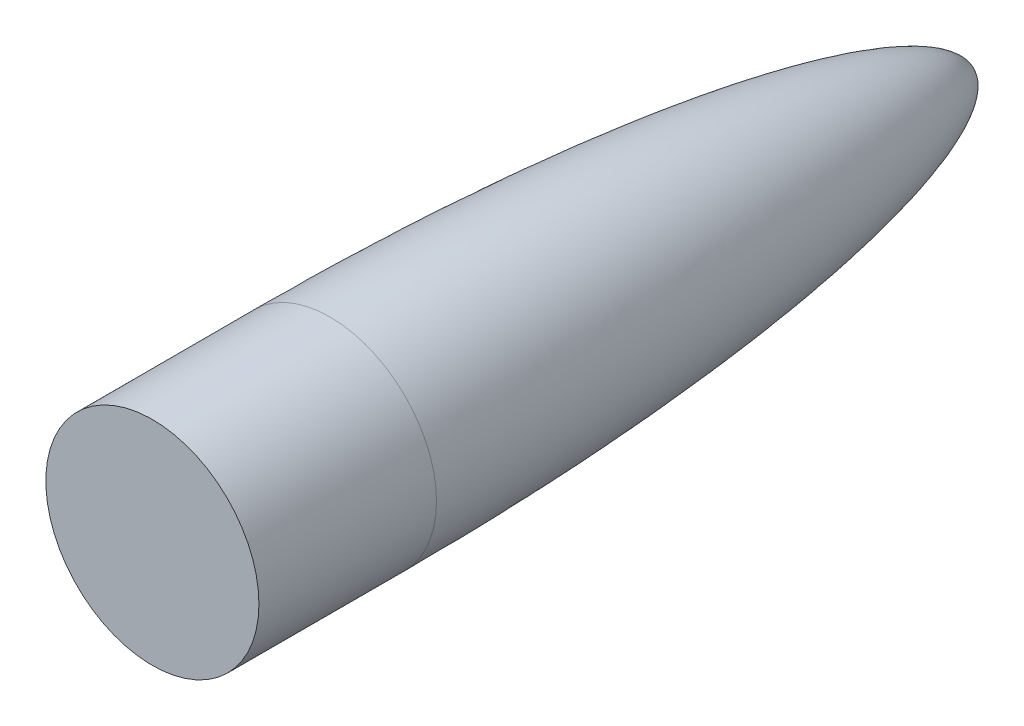
ISO-10303-21;
HEADER;
FILE_DESCRIPTION(('STEP AP214'),'2;1');
FILE_NAME('part.step','',(''),(''),'','','');
FILE_SCHEMA(('AUTOMOTIVE_DESIGN { 1 0 10303 214 1 1 1 1 }'));
ENDSEC;
DATA;
#1=APPLICATION_CONTEXT('core data for automotive mechanical design processes');
#2=APPLICATION_PROTOCOL_DEFINITION('international standard','automotive_design',2000,#1);
#3=PRODUCT_CONTEXT('',#1,'mechanical');
#4=PRODUCT('Part','Part','',(#3));
#5=PRODUCT_RELATED_PRODUCT_CATEGORY('part','',(#4));
#6=PRODUCT_DEFINITION_FORMATION('','',#4);
#7=PRODUCT_DEFINITION_CONTEXT('part definition',#1,'design');
#8=PRODUCT_DEFINITION('design','',#6,#7);
#9=PRODUCT_DEFINITION_SHAPE('','',#8);
#10=(LENGTH_UNIT() NAMED_UNIT(*) SI_UNIT(.MILLI.,.METRE.));
#11=(NAMED_UNIT(*) PLANE_ANGLE_UNIT() SI_UNIT($,.RADIAN.));
#12=(NAMED_UNIT(*) SI_UNIT($,.STERADIAN.) SOLID_ANGLE_UNIT());
#13=UNCERTAINTY_MEASURE_WITH_UNIT(LENGTH_MEASURE(1.E-05),#10,'distance_accuracy_value','');
#14=(GEOMETRIC_REPRESENTATION_CONTEXT(3) GLOBAL_UNCERTAINTY_ASSIGNED_CONTEXT((#13)) GLOBAL_UNIT_ASSIGNED_CONTEXT((#10,
#11,#12)) REPRESENTATION_CONTEXT('',''));
#15=CARTESIAN_POINT('',(0.,0.,0.));
#16=DIRECTION('',(0.,0.,1.));
#17=DIRECTION('',(1.,0.,0.));
#18=AXIS2_PLACEMENT_3D('',#15,#16,#17);
#19=CARTESIAN_POINT('',(0.,0.,127.));
#20=DIRECTION('',(0.,0.,-1.));
#21=DIRECTION('',(-1.,0.,0.));
#22=AXIS2_PLACEMENT_3D('',#19,#20,#21);
#23=CYLINDRICAL_SURFACE('',#22,76.2);
#24=CARTESIAN_POINT('',(0.,0.,127.));
#25=DIRECTION('',(0.,0.,1.));
#26=DIRECTION('',(1.,0.,0.));
#27=AXIS2_PLACEMENT_3D('',#24,#25,#26);
#28=CIRCLE('',#27,76.2);
#29=CARTESIAN_POINT('',(76.2,0.,127.));
#30=VERTEX_POINT('',#29);
#31=EDGE_CURVE('E11',#30,#30,#28,.T.);
#32=ORIENTED_EDGE('',*,*,#31,.F.);
#33=EDGE_LOOP('',(#32));
#34=FACE_BOUND('',#33,.T.);
#35=CARTESIAN_POINT('',(0.,0.,0.));
#36=DIRECTION('',(0.,0.,1.));
#37=DIRECTION('',(1.,0.,0.));
#38=AXIS2_PLACEMENT_3D('',#35,#36,#37);
#39=CIRCLE('',#38,76.2);
#40=CARTESIAN_POINT('',(76.2,0.,0.));
#41=VERTEX_POINT('',#40);
#42=EDGE_CURVE('E50',#41,#41,#39,.T.);
#43=ORIENTED_EDGE('',*,*,#42,.T.);
#44=EDGE_LOOP('',(#43));
#45=FACE_BOUND('',#44,.T.);
#46=ADVANCED_FACE('F39',(#34,#45),#23,.T.);
#47=CARTESIAN_POINT('',(0.,0.,127.));
#48=DIRECTION('',(0.,0.,1.));
#49=DIRECTION('',(1.,0.,0.));
#50=AXIS2_PLACEMENT_3D('',#47,#48,#49);
#51=PLANE('',#50);
#52=ORIENTED_EDGE('',*,*,#31,.T.);
#53=EDGE_LOOP('',(#52));
#54=FACE_BOUND('',#53,.T.);
#55=ADVANCED_FACE('F55',(#54),#51,.T.);
#56=CARTESIAN_POINT('',(0.,0.,-457.20000000036));
#57=CARTESIAN_POINT('',(0.,0.534505425826204,-457.199999783027));
#58=CARTESIAN_POINT('',(0.,1.42373238134091,-457.150080641547));
#59=CARTESIAN_POINT('',(0.,2.71521923637677,-456.955614881372));
#60=CARTESIAN_POINT('',(0.,4.4129638087914,-456.47260424758));
#61=CARTESIAN_POINT('',(0.,6.06046271653739,-455.800493322826));
#62=CARTESIAN_POINT('',(0.,7.9044388777587,-454.795004943715));
#63=CARTESIAN_POINT('',(0.,9.93908196723226,-453.370933283402));
#64=CARTESIAN_POINT('',(0.,12.2396075194511,-451.362493850984));
#65=CARTESIAN_POINT('',(0.,14.9275067360262,-448.481131890771));
#66=CARTESIAN_POINT('',(0.,18.1347136218381,-444.276883573398));
#67=CARTESIAN_POINT('',(0.,22.0574497401589,-437.961024740608));
#68=CARTESIAN_POINT('',(0.,26.8878539745448,-428.331965642796));
#69=CARTESIAN_POINT('',(0.,32.9593931991319,-413.166178505043));
#70=CARTESIAN_POINT('',(0.,39.8262165836885,-391.16484797936));
#71=CARTESIAN_POINT('',(0.,46.6366242791751,-363.148103265867));
#72=CARTESIAN_POINT('',(0.,52.08429790659,-334.84196883935));
#73=CARTESIAN_POINT('',(0.,56.2601064366329,-308.986583678613));
#74=CARTESIAN_POINT('',(0.,59.3136054356389,-287.376938666396));
#75=CARTESIAN_POINT('',(0.,61.529567186895,-270.058940881115));
#76=CARTESIAN_POINT('',(0.,63.5406140090686,-252.715935845925));
#77=CARTESIAN_POINT('',(0.,65.3647843318999,-235.352399190773));
#78=CARTESIAN_POINT('',(0.,67.0163771063259,-217.971608603075));
#79=CARTESIAN_POINT('',(0.,68.5073135504202,-200.576347756858));
#80=CARTESIAN_POINT('',(0.,69.8473256228097,-183.168839163237));
#81=CARTESIAN_POINT('',(0.,71.0445829697644,-165.750929012654));
#82=CARTESIAN_POINT('',(0.,71.9731931533787,-150.502604003337));
#83=CARTESIAN_POINT('',(0.,72.6877041595647,-137.42788786144));
#84=CARTESIAN_POINT('',(0.,73.2303042555184,-126.529690709381));
#85=CARTESIAN_POINT('',(0.,73.6332307411631,-117.809424576478));
#86=CARTESIAN_POINT('',(0.,74.0985534776012,-106.907850963105));
#87=CARTESIAN_POINT('',(0.,74.5964925216243,-93.8226418273542));
#88=CARTESIAN_POINT('',(0.,75.0910094922741,-78.5549922327913));
#89=CARTESIAN_POINT('',(0.,75.4840660879397,-63.2820804128631));
#90=CARTESIAN_POINT('',(0.,75.7497354297913,-50.1926820544756));
#91=CARTESIAN_POINT('',(0.,75.9066526777867,-40.3701170237372));
#92=CARTESIAN_POINT('',(0.,75.9937181520794,-33.8295867266813));
#93=CARTESIAN_POINT('',(0.,76.0546124076784,-28.36285029086));
#94=CARTESIAN_POINT('',(0.,76.096344577244,-24.0209759017673));
#95=CARTESIAN_POINT('',(0.,76.1311045577172,-19.6130894990075));
#96=CARTESIAN_POINT('',(0.,76.1589015464869,-15.3250603335263));
#97=CARTESIAN_POINT('',(0.,76.1797428784855,-10.8242807370204));
#98=CARTESIAN_POINT('',(0.,76.1936340507851,-6.72201940317497));
#99=CARTESIAN_POINT('',(0.,76.1988425547278,-3.01641859044547));
#100=CARTESIAN_POINT('',(0.,76.2000000000003,-0.995244189261283));
#101=CARTESIAN_POINT('',(0.,76.1999999999999,3.60062129747767E-10));
#102=B_SPLINE_CURVE_WITH_KNOTS('',4,(#56,#57,#58,#59,#60,#61,#62,#63,#64,#65,#66,#67,#68,#69,
#70,#71,#72,#73,#74,#75,#76,#77,#78,#79,#80,#81,#82,#83,#84,#85,#86,#87,#88,#89,#90,#91,#92,#93,
#94,#95,#96,#97,#98,#99,#100,#101),.UNSPECIFIED.,.F.,.F.,(5,1,1,1,1,1,1,1,1,1,1,1,1,1,1,1,1,1,1,
1,1,1,1,1,1,1,1,1,1,1,1,1,1,1,1,1,1,1,1,1,1,1,5),(0.0879155684168332,0.0920262599332427,
0.0947550636892094,0.0979296520249649,0.101464838756749,0.105683433455944,0.110876163072534,
0.116992387980646,0.124911267931314,0.135941903085037,0.151483869343221,0.17409533273689,
0.207665509664601,0.261455620271705,0.32859600017871,0.395736396353935,0.429306598054865,
0.462876799755795,0.496446998629301,0.530017197502807,0.563587397258234,0.597157597013661,
0.63072779723917,0.664297997464679,0.697868197835398,0.731438398206117,0.748223498368376,
0.765008598530634,0.781793698692893,0.798578798855152,0.832148999058347,0.865719199261542,
0.899289399410718,0.916074499485305,0.932859599559893,0.941252149614906,0.94964469966992,
0.958037249724933,0.966429799779947,0.97482234983496,0.983214899889973,0.991607449944987,1.),.UNSPECIFIED.);
#103=CARTESIAN_POINT('',(0.,0.,-480.060000000396));
#104=DIRECTION('',(0.,0.,-1.));
#105=AXIS1_PLACEMENT('',#103,#104);
#106=SURFACE_OF_REVOLUTION('',#102,#105);
#107=ORIENTED_EDGE('',*,*,#42,.F.);
#108=EDGE_LOOP('',(#107));
#109=FACE_BOUND('',#108,.T.);
#110=CARTESIAN_POINT('',(0.,0.,-457.20000000036));
#111=VERTEX_POINT('',#110);
#112=VERTEX_LOOP('',#111);
#113=FACE_BOUND('',#112,.T.);
#114=ADVANCED_FACE('F41',(#109,#113),#106,.F.);
#115=CLOSED_SHELL('',(#46,#55,#114));
#116=MANIFOLD_SOLID_BREP('B2',#115);
#117=ADVANCED_BREP_SHAPE_REPRESENTATION('',(#18,#116),#14);
#118=SHAPE_DEFINITION_REPRESENTATION(#9,#117);
ENDSEC;
END-ISO-10303-21;
